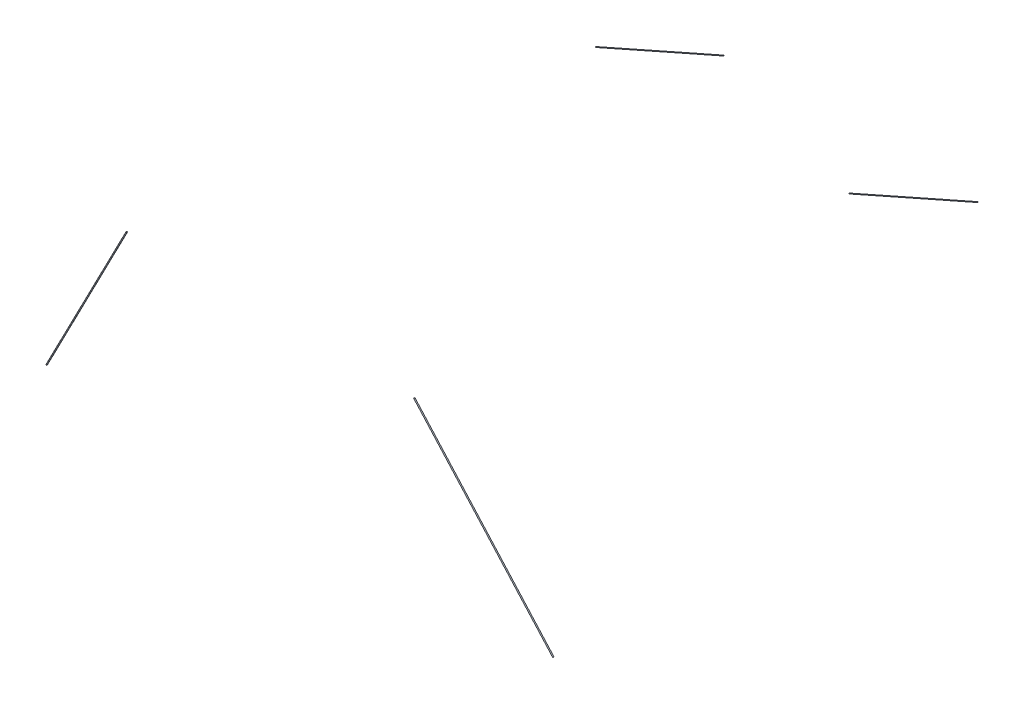
ISO-10303-21;
HEADER;
FILE_DESCRIPTION(('STEP AP214'),'2;1');
FILE_NAME('part.step','',(''),(''),'','','');
FILE_SCHEMA(('AUTOMOTIVE_DESIGN { 1 0 10303 214 1 1 1 1 }'));
ENDSEC;
DATA;
#1=APPLICATION_CONTEXT('core data for automotive mechanical design processes');
#2=APPLICATION_PROTOCOL_DEFINITION('international standard','automotive_design',2000,#1);
#3=PRODUCT_CONTEXT('',#1,'mechanical');
#4=PRODUCT('Part','Part','',(#3));
#5=PRODUCT_RELATED_PRODUCT_CATEGORY('part','',(#4));
#6=PRODUCT_DEFINITION_FORMATION('','',#4);
#7=PRODUCT_DEFINITION_CONTEXT('part definition',#1,'design');
#8=PRODUCT_DEFINITION('design','',#6,#7);
#9=PRODUCT_DEFINITION_SHAPE('','',#8);
#10=(LENGTH_UNIT() NAMED_UNIT(*) SI_UNIT(.MILLI.,.METRE.));
#11=(NAMED_UNIT(*) PLANE_ANGLE_UNIT() SI_UNIT($,.RADIAN.));
#12=(NAMED_UNIT(*) SI_UNIT($,.STERADIAN.) SOLID_ANGLE_UNIT());
#13=UNCERTAINTY_MEASURE_WITH_UNIT(LENGTH_MEASURE(1.E-05),#10,'distance_accuracy_value','');
#14=(GEOMETRIC_REPRESENTATION_CONTEXT(3) GLOBAL_UNCERTAINTY_ASSIGNED_CONTEXT((#13)) GLOBAL_UNIT_ASSIGNED_CONTEXT((#10,
#11,#12)) REPRESENTATION_CONTEXT('',''));
#15=CARTESIAN_POINT('',(0.,0.,0.));
#16=DIRECTION('',(0.,0.,1.));
#17=DIRECTION('',(1.,0.,0.));
#18=AXIS2_PLACEMENT_3D('',#15,#16,#17);
#19=CARTESIAN_POINT('',(-323.501211219642,479.709448623526,234.199818078457));
#20=DIRECTION('',(-0.50580491203969,-0.851809863824775,-0.136313414040363));
#21=DIRECTION('',(-0.859835775089742,0.510570700173661,0.));
#22=AXIS2_PLACEMENT_3D('',#19,#20,#21);
#23=PLANE('',#22);
#24=CARTESIAN_POINT('',(-323.501211219642,479.709448623526,234.199818078457));
#25=DIRECTION('',(0.50580491203969,0.851809863824775,0.136313414040363));
#26=DIRECTION('',(-0.859835775089742,0.510570700173661,0.));
#27=AXIS2_PLACEMENT_3D('',#24,#25,#26);
#28=CIRCLE('',#27,1.19062499999998);
#29=CARTESIAN_POINT('',(-324.524953189359,480.31734686342,234.199818078457));
#30=VERTEX_POINT('',#29);
#31=EDGE_CURVE('E64',#30,#30,#28,.T.);
#32=ORIENTED_EDGE('',*,*,#31,.T.);
#33=EDGE_LOOP('',(#32));
#34=FACE_BOUND('',#33,.T.);
#35=ADVANCED_FACE('F58',(#34),#23,.F.);
#36=CARTESIAN_POINT('',(-569.868046841893,64.8109458468993,167.804447708162));
#37=DIRECTION('',(-0.50580491203969,-0.851809863824775,-0.136313414040363));
#38=DIRECTION('',(-0.859835775089742,0.510570700173661,0.));
#39=AXIS2_PLACEMENT_3D('',#36,#37,#38);
#40=PLANE('',#39);
#41=CARTESIAN_POINT('',(-569.868046841893,64.8109458468993,167.804447708162));
#42=DIRECTION('',(0.50580491203969,0.851809863824775,0.136313414040363));
#43=DIRECTION('',(-0.859835775089742,0.510570700173661,0.));
#44=AXIS2_PLACEMENT_3D('',#41,#42,#43);
#45=CIRCLE('',#44,1.19062499999998);
#46=CARTESIAN_POINT('',(-570.89178881161,65.4188440867935,167.804447708162));
#47=VERTEX_POINT('',#46);
#48=EDGE_CURVE('E12',#47,#47,#45,.T.);
#49=ORIENTED_EDGE('',*,*,#48,.F.);
#50=EDGE_LOOP('',(#49));
#51=FACE_BOUND('',#50,.T.);
#52=ADVANCED_FACE('F73',(#51),#40,.T.);
#53=CARTESIAN_POINT('',(-323.501211219642,479.709448623526,234.199818078457));
#54=DIRECTION('',(-0.50580491203969,-0.851809863824775,-0.136313414040363));
#55=DIRECTION('',(-0.859835775089742,0.510570700173661,0.));
#56=AXIS2_PLACEMENT_3D('',#53,#54,#55);
#57=CYLINDRICAL_SURFACE('',#56,1.19062499999998);
#58=ORIENTED_EDGE('',*,*,#48,.T.);
#59=EDGE_LOOP('',(#58));
#60=FACE_BOUND('',#59,.T.);
#61=ORIENTED_EDGE('',*,*,#31,.F.);
#62=EDGE_LOOP('',(#61));
#63=FACE_BOUND('',#62,.T.);
#64=ADVANCED_FACE('F71',(#60,#63),#57,.T.);
#65=CLOSED_SHELL('',(#35,#52,#64));
#66=MANIFOLD_SOLID_BREP('B2',#65);
#67=CARTESIAN_POINT('',(-285.474604576393,350.615166873992,-782.773583611827));
#68=DIRECTION('',(0.,-0.487265166837637,-0.873254062221694));
#69=DIRECTION('',(0.,0.873254062221694,-0.487265166837637));
#70=AXIS2_PLACEMENT_3D('',#67,#68,#69);
#71=PLANE('',#70);
#72=CARTESIAN_POINT('',(-285.474604576393,350.615166873992,-782.773583611827));
#73=DIRECTION('',(0.,0.487265166837637,0.873254062221694));
#74=DIRECTION('',(0.,0.873254062221694,-0.487265166837637));
#75=AXIS2_PLACEMENT_3D('',#72,#73,#74);
#76=CIRCLE('',#75,0.793749999999982);
#77=CARTESIAN_POINT('',(-285.474604576393,351.308312285881,-783.160350338004));
#78=VERTEX_POINT('',#77);
#79=EDGE_CURVE('E112',#78,#78,#76,.T.);
#80=ORIENTED_EDGE('',*,*,#79,.T.);
#81=EDGE_LOOP('',(#80));
#82=FACE_BOUND('',#81,.T.);
#83=ADVANCED_FACE('F106',(#82),#71,.F.);
#84=CARTESIAN_POINT('',(-285.474604576393,189.720208784203,-1071.12207495743));
#85=DIRECTION('',(0.,-0.487265166837637,-0.873254062221694));
#86=DIRECTION('',(0.,0.873254062221694,-0.487265166837637));
#87=AXIS2_PLACEMENT_3D('',#84,#85,#86);
#88=PLANE('',#87);
#89=CARTESIAN_POINT('',(-285.474604576393,189.720208784203,-1071.12207495743));
#90=DIRECTION('',(0.,0.487265166837637,0.873254062221694));
#91=DIRECTION('',(0.,0.873254062221694,-0.487265166837637));
#92=AXIS2_PLACEMENT_3D('',#89,#90,#91);
#93=CIRCLE('',#92,0.793749999999982);
#94=CARTESIAN_POINT('',(-285.474604576393,190.413354196091,-1071.50884168361));
#95=VERTEX_POINT('',#94);
#96=EDGE_CURVE('E57',#95,#95,#93,.T.);
#97=ORIENTED_EDGE('',*,*,#96,.F.);
#98=EDGE_LOOP('',(#97));
#99=FACE_BOUND('',#98,.T.);
#100=ADVANCED_FACE('F121',(#99),#88,.T.);
#101=CARTESIAN_POINT('',(-285.474604576393,350.615166873992,-782.773583611827));
#102=DIRECTION('',(0.,-0.487265166837637,-0.873254062221694));
#103=DIRECTION('',(0.,0.873254062221694,-0.487265166837637));
#104=AXIS2_PLACEMENT_3D('',#101,#102,#103);
#105=CYLINDRICAL_SURFACE('',#104,0.793749999999982);
#106=ORIENTED_EDGE('',*,*,#96,.T.);
#107=EDGE_LOOP('',(#106));
#108=FACE_BOUND('',#107,.T.);
#109=ORIENTED_EDGE('',*,*,#79,.F.);
#110=EDGE_LOOP('',(#109));
#111=FACE_BOUND('',#110,.T.);
#112=ADVANCED_FACE('F119',(#108,#111),#105,.T.);
#113=CLOSED_SHELL('',(#83,#100,#112));
#114=MANIFOLD_SOLID_BREP('B7',#113);
#115=CARTESIAN_POINT('',(323.501211219642,479.709448623526,234.199818078457));
#116=DIRECTION('',(0.50580491203969,-0.851809863824775,-0.136313414040363));
#117=DIRECTION('',(0.859835775089742,0.510570700173661,0.));
#118=AXIS2_PLACEMENT_3D('',#115,#116,#117);
#119=PLANE('',#118);
#120=CARTESIAN_POINT('',(323.501211219642,479.709448623526,234.199818078457));
#121=DIRECTION('',(0.50580491203969,-0.851809863824775,-0.136313414040363));
#122=DIRECTION('',(0.859835775089742,0.510570700173661,0.));
#123=AXIS2_PLACEMENT_3D('',#120,#121,#122);
#124=CIRCLE('',#123,1.19062499999998);
#125=CARTESIAN_POINT('',(324.524953189359,480.31734686342,234.199818078457));
#126=VERTEX_POINT('',#125);
#127=EDGE_CURVE('E160',#126,#126,#124,.T.);
#128=ORIENTED_EDGE('',*,*,#127,.F.);
#129=EDGE_LOOP('',(#128));
#130=FACE_BOUND('',#129,.T.);
#131=ADVANCED_FACE('F154',(#130),#119,.F.);
#132=CARTESIAN_POINT('',(569.868046841893,64.8109458468993,167.804447708162));
#133=DIRECTION('',(0.50580491203969,-0.851809863824775,-0.136313414040363));
#134=DIRECTION('',(0.859835775089742,0.510570700173661,0.));
#135=AXIS2_PLACEMENT_3D('',#132,#133,#134);
#136=PLANE('',#135);
#137=CARTESIAN_POINT('',(569.868046841893,64.8109458468993,167.804447708162));
#138=DIRECTION('',(0.50580491203969,-0.851809863824775,-0.136313414040363));
#139=DIRECTION('',(0.859835775089742,0.510570700173661,0.));
#140=AXIS2_PLACEMENT_3D('',#137,#138,#139);
#141=CIRCLE('',#140,1.19062499999998);
#142=CARTESIAN_POINT('',(570.89178881161,65.4188440867935,167.804447708162));
#143=VERTEX_POINT('',#142);
#144=EDGE_CURVE('E105',#143,#143,#141,.T.);
#145=ORIENTED_EDGE('',*,*,#144,.T.);
#146=EDGE_LOOP('',(#145));
#147=FACE_BOUND('',#146,.T.);
#148=ADVANCED_FACE('F169',(#147),#136,.T.);
#149=CARTESIAN_POINT('',(323.501211219642,479.709448623526,234.199818078457));
#150=DIRECTION('',(0.50580491203969,-0.851809863824775,-0.136313414040363));
#151=DIRECTION('',(0.859835775089742,0.510570700173661,0.));
#152=AXIS2_PLACEMENT_3D('',#149,#150,#151);
#153=CYLINDRICAL_SURFACE('',#152,1.19062499999998);
#154=ORIENTED_EDGE('',*,*,#144,.F.);
#155=EDGE_LOOP('',(#154));
#156=FACE_BOUND('',#155,.T.);
#157=ORIENTED_EDGE('',*,*,#127,.T.);
#158=EDGE_LOOP('',(#157));
#159=FACE_BOUND('',#158,.T.);
#160=ADVANCED_FACE('F166',(#156,#159),#153,.T.);
#161=CLOSED_SHELL('',(#131,#148,#160));
#162=MANIFOLD_SOLID_BREP('B52',#161);
#163=CARTESIAN_POINT('',(285.474604576393,350.615166873992,-782.773583611827));
#164=DIRECTION('',(0.,-0.487265166837637,-0.873254062221694));
#165=DIRECTION('',(0.,0.873254062221694,-0.487265166837637));
#166=AXIS2_PLACEMENT_3D('',#163,#164,#165);
#167=PLANE('',#166);
#168=CARTESIAN_POINT('',(285.474604576393,350.615166873992,-782.773583611827));
#169=DIRECTION('',(0.,-0.487265166837637,-0.873254062221694));
#170=DIRECTION('',(0.,0.873254062221694,-0.487265166837637));
#171=AXIS2_PLACEMENT_3D('',#168,#169,#170);
#172=CIRCLE('',#171,0.793749999999982);
#173=CARTESIAN_POINT('',(285.474604576393,351.308312285881,-783.160350338004));
#174=VERTEX_POINT('',#173);
#175=EDGE_CURVE('E200',#174,#174,#172,.T.);
#176=ORIENTED_EDGE('',*,*,#175,.F.);
#177=EDGE_LOOP('',(#176));
#178=FACE_BOUND('',#177,.T.);
#179=ADVANCED_FACE('F194',(#178),#167,.F.);
#180=CARTESIAN_POINT('',(285.474604576393,189.720208784203,-1071.12207495743));
#181=DIRECTION('',(0.,-0.487265166837637,-0.873254062221694));
#182=DIRECTION('',(0.,0.873254062221694,-0.487265166837637));
#183=AXIS2_PLACEMENT_3D('',#180,#181,#182);
#184=PLANE('',#183);
#185=CARTESIAN_POINT('',(285.474604576393,189.720208784203,-1071.12207495743));
#186=DIRECTION('',(0.,-0.487265166837637,-0.873254062221694));
#187=DIRECTION('',(0.,0.873254062221694,-0.487265166837637));
#188=AXIS2_PLACEMENT_3D('',#185,#186,#187);
#189=CIRCLE('',#188,0.793749999999982);
#190=CARTESIAN_POINT('',(285.474604576393,190.413354196091,-1071.50884168361));
#191=VERTEX_POINT('',#190);
#192=EDGE_CURVE('E153',#191,#191,#189,.T.);
#193=ORIENTED_EDGE('',*,*,#192,.T.);
#194=EDGE_LOOP('',(#193));
#195=FACE_BOUND('',#194,.T.);
#196=ADVANCED_FACE('F209',(#195),#184,.T.);
#197=CARTESIAN_POINT('',(285.474604576393,350.615166873992,-782.773583611827));
#198=DIRECTION('',(0.,-0.487265166837637,-0.873254062221694));
#199=DIRECTION('',(0.,0.873254062221694,-0.487265166837637));
#200=AXIS2_PLACEMENT_3D('',#197,#198,#199);
#201=CYLINDRICAL_SURFACE('',#200,0.793749999999982);
#202=ORIENTED_EDGE('',*,*,#192,.F.);
#203=EDGE_LOOP('',(#202));
#204=FACE_BOUND('',#203,.T.);
#205=ORIENTED_EDGE('',*,*,#175,.T.);
#206=EDGE_LOOP('',(#205));
#207=FACE_BOUND('',#206,.T.);
#208=ADVANCED_FACE('F206',(#204,#207),#201,.T.);
#209=CLOSED_SHELL('',(#179,#196,#208));
#210=MANIFOLD_SOLID_BREP('B100',#209);
#211=ADVANCED_BREP_SHAPE_REPRESENTATION('',(#18,#66,#114,#162,#210),#14);
#212=SHAPE_DEFINITION_REPRESENTATION(#9,#211);
ENDSEC;
END-ISO-10303-21;
